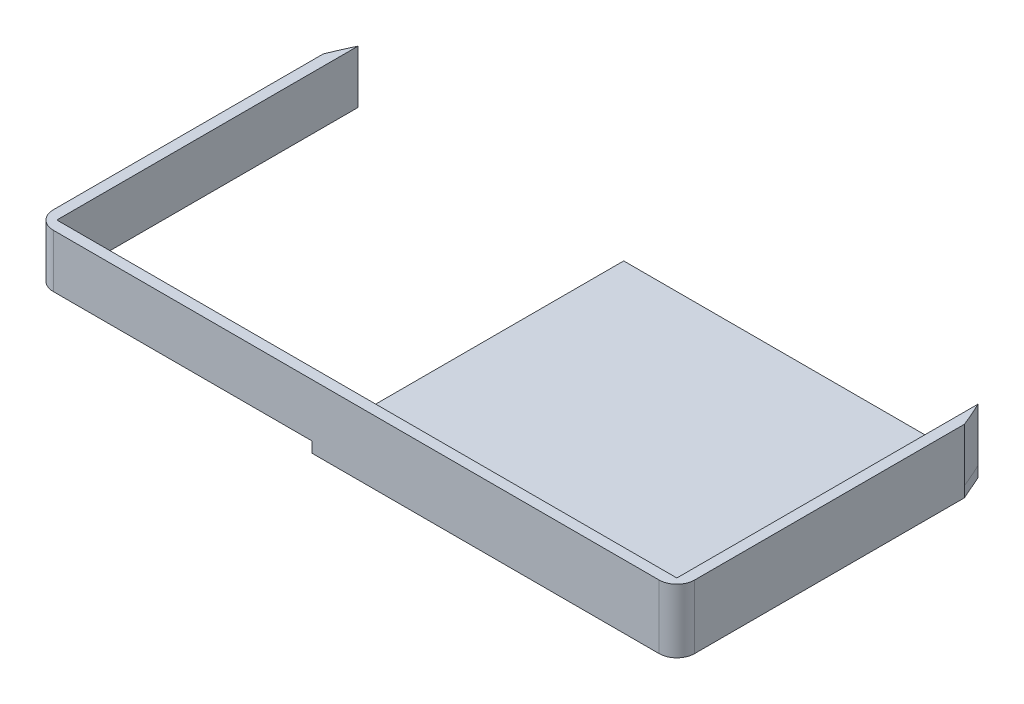
ISO-10303-21;
HEADER;
FILE_DESCRIPTION(('STEP AP214'),'2;1');
FILE_NAME('part.step','',(''),(''),'','','');
FILE_SCHEMA(('AUTOMOTIVE_DESIGN { 1 0 10303 214 1 1 1 1 }'));
ENDSEC;
DATA;
#1=APPLICATION_CONTEXT('core data for automotive mechanical design processes');
#2=APPLICATION_PROTOCOL_DEFINITION('international standard','automotive_design',2000,#1);
#3=PRODUCT_CONTEXT('',#1,'mechanical');
#4=PRODUCT('Part','Part','',(#3));
#5=PRODUCT_RELATED_PRODUCT_CATEGORY('part','',(#4));
#6=PRODUCT_DEFINITION_FORMATION('','',#4);
#7=PRODUCT_DEFINITION_CONTEXT('part definition',#1,'design');
#8=PRODUCT_DEFINITION('design','',#6,#7);
#9=PRODUCT_DEFINITION_SHAPE('','',#8);
#10=(LENGTH_UNIT() NAMED_UNIT(*) SI_UNIT(.MILLI.,.METRE.));
#11=(NAMED_UNIT(*) PLANE_ANGLE_UNIT() SI_UNIT($,.RADIAN.));
#12=(NAMED_UNIT(*) SI_UNIT($,.STERADIAN.) SOLID_ANGLE_UNIT());
#13=UNCERTAINTY_MEASURE_WITH_UNIT(LENGTH_MEASURE(1.E-05),#10,'distance_accuracy_value','');
#14=(GEOMETRIC_REPRESENTATION_CONTEXT(3) GLOBAL_UNCERTAINTY_ASSIGNED_CONTEXT((#13)) GLOBAL_UNIT_ASSIGNED_CONTEXT((#10,
#11,#12)) REPRESENTATION_CONTEXT('',''));
#15=CARTESIAN_POINT('',(0.,0.,0.));
#16=DIRECTION('',(0.,0.,1.));
#17=DIRECTION('',(1.,0.,0.));
#18=AXIS2_PLACEMENT_3D('',#15,#16,#17);
#19=CARTESIAN_POINT('',(0.,0.,0.));
#20=DIRECTION('',(0.,1.,0.));
#21=DIRECTION('',(0.,0.,1.));
#22=AXIS2_PLACEMENT_3D('',#19,#20,#21);
#23=PLANE('',#22);
#24=CARTESIAN_POINT('',(0.,0.,0.));
#25=DIRECTION('',(0.,1.,0.));
#26=DIRECTION('',(0.,0.,1.));
#27=AXIS2_PLACEMENT_3D('',#24,#25,#26);
#28=CIRCLE('',#27,97.2753822917186);
#29=CARTESIAN_POINT('',(87.5,0.,-42.5));
#30=VERTEX_POINT('',#29);
#31=CARTESIAN_POINT('',(90.5,0.,-35.6686136540236));
#32=VERTEX_POINT('',#31);
#33=EDGE_CURVE('E160',#30,#32,#28,.F.);
#34=ORIENTED_EDGE('',*,*,#33,.T.);
#35=DIRECTION('',(-0.402086111054041,0.,-0.915601856320441));
#36=VECTOR('',#35,1.);
#37=CARTESIAN_POINT('',(87.5,0.,-42.5));
#38=LINE('',#37,#36);
#39=EDGE_CURVE('E300',#32,#30,#38,.T.);
#40=ORIENTED_EDGE('',*,*,#39,.T.);
#41=EDGE_LOOP('',(#34,#40));
#42=FACE_BOUND('',#41,.T.);
#43=ADVANCED_FACE('F41',(#42),#23,.F.);
#44=CARTESIAN_POINT('',(-85.5,15.,40.5));
#45=DIRECTION('',(0.,-1.,0.));
#46=DIRECTION('',(0.,0.,-1.));
#47=AXIS2_PLACEMENT_3D('',#44,#45,#46);
#48=CYLINDRICAL_SURFACE('',#47,5.);
#49=CARTESIAN_POINT('',(-85.5,0.,40.5));
#50=DIRECTION('',(0.,1.,0.));
#51=DIRECTION('',(0.,0.,1.));
#52=AXIS2_PLACEMENT_3D('',#49,#50,#51);
#53=CIRCLE('',#52,5.);
#54=CARTESIAN_POINT('',(-85.5,0.,45.5));
#55=VERTEX_POINT('',#54);
#56=CARTESIAN_POINT('',(-90.5,0.,40.5));
#57=VERTEX_POINT('',#56);
#58=EDGE_CURVE('E152',#55,#57,#53,.F.);
#59=ORIENTED_EDGE('',*,*,#58,.F.);
#60=DIRECTION('',(0.,-1.,0.));
#61=VECTOR('',#60,1.);
#62=CARTESIAN_POINT('',(-85.5,15.,45.5));
#63=LINE('',#62,#61);
#64=CARTESIAN_POINT('',(-85.5,15.,45.5));
#65=VERTEX_POINT('',#64);
#66=EDGE_CURVE('E45',#65,#55,#63,.T.);
#67=ORIENTED_EDGE('',*,*,#66,.F.);
#68=CARTESIAN_POINT('',(-85.5,15.,40.5));
#69=DIRECTION('',(0.,1.,0.));
#70=DIRECTION('',(0.,0.,1.));
#71=AXIS2_PLACEMENT_3D('',#68,#69,#70);
#72=CIRCLE('',#71,5.);
#73=CARTESIAN_POINT('',(-90.5,15.,40.5));
#74=VERTEX_POINT('',#73);
#75=EDGE_CURVE('E182',#65,#74,#72,.F.);
#76=ORIENTED_EDGE('',*,*,#75,.T.);
#77=DIRECTION('',(0.,-1.,0.));
#78=VECTOR('',#77,1.);
#79=CARTESIAN_POINT('',(-90.5,15.,40.5));
#80=LINE('',#79,#78);
#81=EDGE_CURVE('E67',#74,#57,#80,.T.);
#82=ORIENTED_EDGE('',*,*,#81,.T.);
#83=EDGE_LOOP('',(#59,#67,#76,#82));
#84=FACE_BOUND('',#83,.T.);
#85=ADVANCED_FACE('F43',(#84),#48,.T.);
#86=CARTESIAN_POINT('',(0.,15.,45.5));
#87=DIRECTION('',(0.,0.,-1.));
#88=DIRECTION('',(-1.,0.,0.));
#89=AXIS2_PLACEMENT_3D('',#86,#87,#88);
#90=PLANE('',#89);
#91=DIRECTION('',(1.,0.,0.));
#92=VECTOR('',#91,1.);
#93=CARTESIAN_POINT('',(0.,0.,45.5));
#94=LINE('',#93,#92);
#95=CARTESIAN_POINT('',(-12.5,0.,45.5));
#96=VERTEX_POINT('',#95);
#97=EDGE_CURVE('E155',#55,#96,#94,.T.);
#98=ORIENTED_EDGE('',*,*,#97,.T.);
#99=DIRECTION('',(0.,1.,0.));
#100=VECTOR('',#99,1.);
#101=CARTESIAN_POINT('',(-12.5,-3.,45.5));
#102=LINE('',#101,#100);
#103=CARTESIAN_POINT('',(-12.5,-3.,45.5));
#104=VERTEX_POINT('',#103);
#105=EDGE_CURVE('E59',#104,#96,#102,.T.);
#106=ORIENTED_EDGE('',*,*,#105,.F.);
#107=DIRECTION('',(1.,0.,0.));
#108=VECTOR('',#107,1.);
#109=CARTESIAN_POINT('',(-12.5,-3.,45.5));
#110=LINE('',#109,#108);
#111=CARTESIAN_POINT('',(85.5,-3.,45.5));
#112=VERTEX_POINT('',#111);
#113=EDGE_CURVE('E296',#104,#112,#110,.T.);
#114=ORIENTED_EDGE('',*,*,#113,.T.);
#115=DIRECTION('',(0.,-1.,0.));
#116=VECTOR('',#115,1.);
#117=CARTESIAN_POINT('',(85.5,15.,45.5));
#118=LINE('',#117,#116);
#119=CARTESIAN_POINT('',(85.5,15.,45.5));
#120=VERTEX_POINT('',#119);
#121=EDGE_CURVE('E204',#120,#112,#118,.T.);
#122=ORIENTED_EDGE('',*,*,#121,.F.);
#123=DIRECTION('',(1.,0.,0.));
#124=VECTOR('',#123,1.);
#125=CARTESIAN_POINT('',(0.,15.,45.5));
#126=LINE('',#125,#124);
#127=EDGE_CURVE('E217',#65,#120,#126,.T.);
#128=ORIENTED_EDGE('',*,*,#127,.F.);
#129=ORIENTED_EDGE('',*,*,#66,.T.);
#130=EDGE_LOOP('',(#98,#106,#114,#122,#128,#129));
#131=FACE_BOUND('',#130,.T.);
#132=ADVANCED_FACE('F216',(#131),#90,.F.);
#133=CARTESIAN_POINT('',(85.5,15.,40.5));
#134=DIRECTION('',(0.,-1.,0.));
#135=DIRECTION('',(0.,0.,-1.));
#136=AXIS2_PLACEMENT_3D('',#133,#134,#135);
#137=CYLINDRICAL_SURFACE('',#136,5.);
#138=ORIENTED_EDGE('',*,*,#121,.T.);
#139=CARTESIAN_POINT('',(85.5,-3.,40.5));
#140=DIRECTION('',(0.,1.,0.));
#141=DIRECTION('',(0.,0.,1.));
#142=AXIS2_PLACEMENT_3D('',#139,#140,#141);
#143=CIRCLE('',#142,5.);
#144=CARTESIAN_POINT('',(90.5,-3.,40.5));
#145=VERTEX_POINT('',#144);
#146=EDGE_CURVE('E290',#112,#145,#143,.T.);
#147=ORIENTED_EDGE('',*,*,#146,.T.);
#148=DIRECTION('',(0.,-1.,0.));
#149=VECTOR('',#148,1.);
#150=CARTESIAN_POINT('',(90.5,15.,40.5));
#151=LINE('',#150,#149);
#152=CARTESIAN_POINT('',(90.5,15.,40.5));
#153=VERTEX_POINT('',#152);
#154=EDGE_CURVE('E201',#153,#145,#151,.T.);
#155=ORIENTED_EDGE('',*,*,#154,.F.);
#156=CARTESIAN_POINT('',(85.5,15.,40.5));
#157=DIRECTION('',(0.,1.,0.));
#158=DIRECTION('',(0.,0.,1.));
#159=AXIS2_PLACEMENT_3D('',#156,#157,#158);
#160=CIRCLE('',#159,5.);
#161=EDGE_CURVE('E321',#120,#153,#160,.T.);
#162=ORIENTED_EDGE('',*,*,#161,.F.);
#163=EDGE_LOOP('',(#138,#147,#155,#162));
#164=FACE_BOUND('',#163,.T.);
#165=ADVANCED_FACE('F225',(#164),#137,.T.);
#166=CARTESIAN_POINT('',(90.5,15.,0.));
#167=DIRECTION('',(-1.,0.,0.));
#168=DIRECTION('',(0.,0.,1.));
#169=AXIS2_PLACEMENT_3D('',#166,#167,#168);
#170=PLANE('',#169);
#171=ORIENTED_EDGE('',*,*,#154,.T.);
#172=DIRECTION('',(0.,0.,-1.));
#173=VECTOR('',#172,1.);
#174=CARTESIAN_POINT('',(90.5,-3.,40.5));
#175=LINE('',#174,#173);
#176=CARTESIAN_POINT('',(90.5,-3.,-35.6686136540236));
#177=VERTEX_POINT('',#176);
#178=EDGE_CURVE('E269',#145,#177,#175,.T.);
#179=ORIENTED_EDGE('',*,*,#178,.T.);
#180=DIRECTION('',(0.,1.,0.));
#181=VECTOR('',#180,1.);
#182=CARTESIAN_POINT('',(90.5,-3.,-35.6686136540236));
#183=LINE('',#182,#181);
#184=EDGE_CURVE('E156',#177,#32,#183,.T.);
#185=ORIENTED_EDGE('',*,*,#184,.T.);
#186=DIRECTION('',(0.,-1.,0.));
#187=VECTOR('',#186,1.);
#188=CARTESIAN_POINT('',(90.5,15.,-35.6686136540236));
#189=LINE('',#188,#187);
#190=CARTESIAN_POINT('',(90.5,15.,-35.6686136540236));
#191=VERTEX_POINT('',#190);
#192=EDGE_CURVE('E197',#191,#32,#189,.T.);
#193=ORIENTED_EDGE('',*,*,#192,.F.);
#194=DIRECTION('',(0.,0.,-1.));
#195=VECTOR('',#194,1.);
#196=CARTESIAN_POINT('',(90.5,15.,0.));
#197=LINE('',#196,#195);
#198=EDGE_CURVE('E324',#153,#191,#197,.T.);
#199=ORIENTED_EDGE('',*,*,#198,.F.);
#200=EDGE_LOOP('',(#171,#179,#185,#193,#199));
#201=FACE_BOUND('',#200,.T.);
#202=ADVANCED_FACE('F282',(#201),#170,.F.);
#203=CARTESIAN_POINT('',(0.,15.,0.));
#204=DIRECTION('',(0.,-1.,0.));
#205=DIRECTION('',(0.,0.,-1.));
#206=AXIS2_PLACEMENT_3D('',#203,#204,#205);
#207=CYLINDRICAL_SURFACE('',#206,97.2753822917186);
#208=ORIENTED_EDGE('',*,*,#33,.F.);
#209=DIRECTION('',(0.,-1.,0.));
#210=VECTOR('',#209,1.);
#211=CARTESIAN_POINT('',(87.5,15.,-42.5));
#212=LINE('',#211,#210);
#213=CARTESIAN_POINT('',(87.5,15.,-42.5));
#214=VERTEX_POINT('',#213);
#215=EDGE_CURVE('E193',#214,#30,#212,.T.);
#216=ORIENTED_EDGE('',*,*,#215,.F.);
#217=CARTESIAN_POINT('',(0.,15.,0.));
#218=DIRECTION('',(0.,1.,0.));
#219=DIRECTION('',(0.,0.,1.));
#220=AXIS2_PLACEMENT_3D('',#217,#218,#219);
#221=CIRCLE('',#220,97.2753822917186);
#222=EDGE_CURVE('E327',#214,#191,#221,.F.);
#223=ORIENTED_EDGE('',*,*,#222,.T.);
#224=ORIENTED_EDGE('',*,*,#192,.T.);
#225=EDGE_LOOP('',(#208,#216,#223,#224));
#226=FACE_BOUND('',#225,.T.);
#227=ADVANCED_FACE('F356',(#226),#207,.T.);
#228=CARTESIAN_POINT('',(87.5,15.,0.));
#229=DIRECTION('',(-1.,0.,0.));
#230=DIRECTION('',(0.,0.,1.));
#231=AXIS2_PLACEMENT_3D('',#228,#229,#230);
#232=PLANE('',#231);
#233=DIRECTION('',(0.,0.,-1.));
#234=VECTOR('',#233,1.);
#235=CARTESIAN_POINT('',(87.5,0.,0.));
#236=LINE('',#235,#234);
#237=CARTESIAN_POINT('',(87.5,0.,42.5));
#238=VERTEX_POINT('',#237);
#239=EDGE_CURVE('E164',#238,#30,#236,.T.);
#240=ORIENTED_EDGE('',*,*,#239,.F.);
#241=DIRECTION('',(0.,-1.,0.));
#242=VECTOR('',#241,1.);
#243=CARTESIAN_POINT('',(87.5,15.,42.5));
#244=LINE('',#243,#242);
#245=CARTESIAN_POINT('',(87.5,15.,42.5));
#246=VERTEX_POINT('',#245);
#247=EDGE_CURVE('E189',#246,#238,#244,.T.);
#248=ORIENTED_EDGE('',*,*,#247,.F.);
#249=DIRECTION('',(0.,0.,-1.));
#250=VECTOR('',#249,1.);
#251=CARTESIAN_POINT('',(87.5,15.,0.));
#252=LINE('',#251,#250);
#253=EDGE_CURVE('E331',#246,#214,#252,.T.);
#254=ORIENTED_EDGE('',*,*,#253,.T.);
#255=ORIENTED_EDGE('',*,*,#215,.T.);
#256=EDGE_LOOP('',(#240,#248,#254,#255));
#257=FACE_BOUND('',#256,.T.);
#258=ADVANCED_FACE('F345',(#257),#232,.T.);
#259=CARTESIAN_POINT('',(0.,15.,42.5));
#260=DIRECTION('',(0.,0.,-1.));
#261=DIRECTION('',(-1.,0.,0.));
#262=AXIS2_PLACEMENT_3D('',#259,#260,#261);
#263=PLANE('',#262);
#264=DIRECTION('',(1.,0.,0.));
#265=VECTOR('',#264,1.);
#266=CARTESIAN_POINT('',(0.,0.,42.5));
#267=LINE('',#266,#265);
#268=CARTESIAN_POINT('',(-87.5,0.,42.5));
#269=VERTEX_POINT('',#268);
#270=CARTESIAN_POINT('',(-12.5,0.,42.5));
#271=VERTEX_POINT('',#270);
#272=EDGE_CURVE('E169',#269,#271,#267,.T.);
#273=ORIENTED_EDGE('',*,*,#272,.F.);
#274=DIRECTION('',(0.,-1.,0.));
#275=VECTOR('',#274,1.);
#276=CARTESIAN_POINT('',(-87.5,15.,42.5));
#277=LINE('',#276,#275);
#278=CARTESIAN_POINT('',(-87.5,15.,42.5));
#279=VERTEX_POINT('',#278);
#280=EDGE_CURVE('E141',#279,#269,#277,.T.);
#281=ORIENTED_EDGE('',*,*,#280,.F.);
#282=DIRECTION('',(1.,0.,0.));
#283=VECTOR('',#282,1.);
#284=CARTESIAN_POINT('',(0.,15.,42.5));
#285=LINE('',#284,#283);
#286=EDGE_CURVE('E128',#279,#246,#285,.T.);
#287=ORIENTED_EDGE('',*,*,#286,.T.);
#288=ORIENTED_EDGE('',*,*,#247,.T.);
#289=EDGE_CURVE('E168',#271,#238,#267,.T.);
#290=ORIENTED_EDGE('',*,*,#289,.F.);
#291=EDGE_LOOP('',(#273,#281,#287,#288,#290));
#292=FACE_BOUND('',#291,.T.);
#293=ADVANCED_FACE('F337',(#292),#263,.T.);
#294=CARTESIAN_POINT('',(-87.5,15.,0.));
#295=DIRECTION('',(-1.,0.,0.));
#296=DIRECTION('',(0.,0.,1.));
#297=AXIS2_PLACEMENT_3D('',#294,#295,#296);
#298=PLANE('',#297);
#299=DIRECTION('',(0.,0.,-1.));
#300=VECTOR('',#299,1.);
#301=CARTESIAN_POINT('',(-87.5,0.,0.));
#302=LINE('',#301,#300);
#303=CARTESIAN_POINT('',(-87.5,0.,-42.5));
#304=VERTEX_POINT('',#303);
#305=EDGE_CURVE('E136',#269,#304,#302,.T.);
#306=ORIENTED_EDGE('',*,*,#305,.T.);
#307=DIRECTION('',(0.,-1.,0.));
#308=VECTOR('',#307,1.);
#309=CARTESIAN_POINT('',(-87.5,15.,-42.5));
#310=LINE('',#309,#308);
#311=CARTESIAN_POINT('',(-87.5,15.,-42.5));
#312=VERTEX_POINT('',#311);
#313=EDGE_CURVE('E133',#312,#304,#310,.T.);
#314=ORIENTED_EDGE('',*,*,#313,.F.);
#315=DIRECTION('',(0.,0.,-1.));
#316=VECTOR('',#315,1.);
#317=CARTESIAN_POINT('',(-87.5,15.,0.));
#318=LINE('',#317,#316);
#319=EDGE_CURVE('E118',#279,#312,#318,.T.);
#320=ORIENTED_EDGE('',*,*,#319,.F.);
#321=ORIENTED_EDGE('',*,*,#280,.T.);
#322=EDGE_LOOP('',(#306,#314,#320,#321));
#323=FACE_BOUND('',#322,.T.);
#324=ADVANCED_FACE('F134',(#323),#298,.F.);
#325=CARTESIAN_POINT('',(0.,15.,0.));
#326=DIRECTION('',(0.,-1.,0.));
#327=DIRECTION('',(0.,0.,-1.));
#328=AXIS2_PLACEMENT_3D('',#325,#326,#327);
#329=CYLINDRICAL_SURFACE('',#328,97.2753822917186);
#330=CARTESIAN_POINT('',(0.,0.,0.));
#331=DIRECTION('',(0.,1.,0.));
#332=DIRECTION('',(0.,0.,1.));
#333=AXIS2_PLACEMENT_3D('',#330,#331,#332);
#334=CIRCLE('',#333,97.2753822917186);
#335=CARTESIAN_POINT('',(-90.5,0.,-35.6686136540235));
#336=VERTEX_POINT('',#335);
#337=EDGE_CURVE('E175',#304,#336,#334,.T.);
#338=ORIENTED_EDGE('',*,*,#337,.T.);
#339=DIRECTION('',(0.,-1.,0.));
#340=VECTOR('',#339,1.);
#341=CARTESIAN_POINT('',(-90.5,15.,-35.6686136540235));
#342=LINE('',#341,#340);
#343=CARTESIAN_POINT('',(-90.5,15.,-35.6686136540235));
#344=VERTEX_POINT('',#343);
#345=EDGE_CURVE('E142',#344,#336,#342,.T.);
#346=ORIENTED_EDGE('',*,*,#345,.F.);
#347=CARTESIAN_POINT('',(0.,15.,0.));
#348=DIRECTION('',(0.,1.,0.));
#349=DIRECTION('',(0.,0.,1.));
#350=AXIS2_PLACEMENT_3D('',#347,#348,#349);
#351=CIRCLE('',#350,97.2753822917186);
#352=EDGE_CURVE('E124',#312,#344,#351,.T.);
#353=ORIENTED_EDGE('',*,*,#352,.F.);
#354=ORIENTED_EDGE('',*,*,#313,.T.);
#355=EDGE_LOOP('',(#338,#346,#353,#354));
#356=FACE_BOUND('',#355,.T.);
#357=ADVANCED_FACE('F144',(#356),#329,.T.);
#358=CARTESIAN_POINT('',(-90.5,15.,0.));
#359=DIRECTION('',(-1.,0.,0.));
#360=DIRECTION('',(0.,0.,1.));
#361=AXIS2_PLACEMENT_3D('',#358,#359,#360);
#362=PLANE('',#361);
#363=DIRECTION('',(0.,0.,-1.));
#364=VECTOR('',#363,1.);
#365=CARTESIAN_POINT('',(-90.5,0.,0.));
#366=LINE('',#365,#364);
#367=EDGE_CURVE('E178',#57,#336,#366,.T.);
#368=ORIENTED_EDGE('',*,*,#367,.F.);
#369=ORIENTED_EDGE('',*,*,#81,.F.);
#370=DIRECTION('',(0.,0.,-1.));
#371=VECTOR('',#370,1.);
#372=CARTESIAN_POINT('',(-90.5,15.,0.));
#373=LINE('',#372,#371);
#374=EDGE_CURVE('E146',#74,#344,#373,.T.);
#375=ORIENTED_EDGE('',*,*,#374,.T.);
#376=ORIENTED_EDGE('',*,*,#345,.T.);
#377=EDGE_LOOP('',(#368,#369,#375,#376));
#378=FACE_BOUND('',#377,.T.);
#379=ADVANCED_FACE('F241',(#378),#362,.T.);
#380=CARTESIAN_POINT('',(0.,15.,0.));
#381=DIRECTION('',(0.,1.,0.));
#382=DIRECTION('',(0.,0.,1.));
#383=AXIS2_PLACEMENT_3D('',#380,#381,#382);
#384=PLANE('',#383);
#385=ORIENTED_EDGE('',*,*,#75,.F.);
#386=ORIENTED_EDGE('',*,*,#127,.T.);
#387=ORIENTED_EDGE('',*,*,#161,.T.);
#388=ORIENTED_EDGE('',*,*,#198,.T.);
#389=ORIENTED_EDGE('',*,*,#222,.F.);
#390=ORIENTED_EDGE('',*,*,#253,.F.);
#391=ORIENTED_EDGE('',*,*,#286,.F.);
#392=ORIENTED_EDGE('',*,*,#319,.T.);
#393=ORIENTED_EDGE('',*,*,#352,.T.);
#394=ORIENTED_EDGE('',*,*,#374,.F.);
#395=EDGE_LOOP('',(#385,#386,#387,#388,#389,#390,#391,#392,#393,#394));
#396=FACE_BOUND('',#395,.T.);
#397=ADVANCED_FACE('F121',(#396),#384,.T.);
#398=ORIENTED_EDGE('',*,*,#272,.T.);
#399=DIRECTION('',(0.,0.,1.));
#400=VECTOR('',#399,1.);
#401=CARTESIAN_POINT('',(-12.5,0.,-42.5));
#402=LINE('',#401,#400);
#403=EDGE_CURVE('E11',#271,#96,#402,.T.);
#404=ORIENTED_EDGE('',*,*,#403,.T.);
#405=ORIENTED_EDGE('',*,*,#97,.F.);
#406=ORIENTED_EDGE('',*,*,#58,.T.);
#407=ORIENTED_EDGE('',*,*,#367,.T.);
#408=ORIENTED_EDGE('',*,*,#337,.F.);
#409=ORIENTED_EDGE('',*,*,#305,.F.);
#410=EDGE_LOOP('',(#398,#404,#405,#406,#407,#408,#409));
#411=FACE_BOUND('',#410,.T.);
#412=ADVANCED_FACE('F219',(#411),#23,.F.);
#413=CARTESIAN_POINT('',(87.5,-3.,-42.5));
#414=DIRECTION('',(0.915601856320441,0.,-0.402086111054041));
#415=DIRECTION('',(-0.402086111054041,0.,-0.915601856320441));
#416=AXIS2_PLACEMENT_3D('',#413,#414,#415);
#417=PLANE('',#416);
#418=ORIENTED_EDGE('',*,*,#39,.F.);
#419=ORIENTED_EDGE('',*,*,#184,.F.);
#420=DIRECTION('',(-0.402086111054041,0.,-0.915601856320441));
#421=VECTOR('',#420,1.);
#422=CARTESIAN_POINT('',(87.5,-3.,-42.5));
#423=LINE('',#422,#421);
#424=CARTESIAN_POINT('',(87.5,-3.,-42.5));
#425=VERTEX_POINT('',#424);
#426=EDGE_CURVE('E266',#177,#425,#423,.T.);
#427=ORIENTED_EDGE('',*,*,#426,.T.);
#428=DIRECTION('',(0.,1.,0.));
#429=VECTOR('',#428,1.);
#430=CARTESIAN_POINT('',(87.5,-3.,-42.5));
#431=LINE('',#430,#429);
#432=EDGE_CURVE('E289',#425,#30,#431,.T.);
#433=ORIENTED_EDGE('',*,*,#432,.T.);
#434=EDGE_LOOP('',(#418,#419,#427,#433));
#435=FACE_BOUND('',#434,.T.);
#436=ADVANCED_FACE('F233',(#435),#417,.T.);
#437=CARTESIAN_POINT('',(-12.5,-3.,-42.5));
#438=DIRECTION('',(-1.,0.,0.));
#439=DIRECTION('',(0.,0.,1.));
#440=AXIS2_PLACEMENT_3D('',#437,#438,#439);
#441=PLANE('',#440);
#442=CARTESIAN_POINT('',(-12.5,0.,-42.5));
#443=VERTEX_POINT('',#442);
#444=EDGE_CURVE('E52',#443,#271,#402,.T.);
#445=ORIENTED_EDGE('',*,*,#444,.F.);
#446=DIRECTION('',(0.,1.,0.));
#447=VECTOR('',#446,1.);
#448=CARTESIAN_POINT('',(-12.5,-3.,-42.5));
#449=LINE('',#448,#447);
#450=CARTESIAN_POINT('',(-12.5,-3.,-42.5));
#451=VERTEX_POINT('',#450);
#452=EDGE_CURVE('E294',#451,#443,#449,.T.);
#453=ORIENTED_EDGE('',*,*,#452,.F.);
#454=DIRECTION('',(0.,0.,1.));
#455=VECTOR('',#454,1.);
#456=CARTESIAN_POINT('',(-12.5,-3.,-42.5));
#457=LINE('',#456,#455);
#458=EDGE_CURVE('E483',#451,#104,#457,.T.);
#459=ORIENTED_EDGE('',*,*,#458,.T.);
#460=ORIENTED_EDGE('',*,*,#105,.T.);
#461=ORIENTED_EDGE('',*,*,#403,.F.);
#462=EDGE_LOOP('',(#445,#453,#459,#460,#461));
#463=FACE_BOUND('',#462,.T.);
#464=ADVANCED_FACE('F238',(#463),#441,.T.);
#465=CARTESIAN_POINT('',(87.5,-3.,-42.5));
#466=DIRECTION('',(0.,0.,-1.));
#467=DIRECTION('',(-1.,0.,0.));
#468=AXIS2_PLACEMENT_3D('',#465,#466,#467);
#469=PLANE('',#468);
#470=DIRECTION('',(-1.,0.,0.));
#471=VECTOR('',#470,1.);
#472=CARTESIAN_POINT('',(87.5,0.,-42.5));
#473=LINE('',#472,#471);
#474=EDGE_CURVE('E304',#30,#443,#473,.T.);
#475=ORIENTED_EDGE('',*,*,#474,.F.);
#476=ORIENTED_EDGE('',*,*,#432,.F.);
#477=DIRECTION('',(-1.,0.,0.));
#478=VECTOR('',#477,1.);
#479=CARTESIAN_POINT('',(87.5,-3.,-42.5));
#480=LINE('',#479,#478);
#481=EDGE_CURVE('E273',#425,#451,#480,.T.);
#482=ORIENTED_EDGE('',*,*,#481,.T.);
#483=ORIENTED_EDGE('',*,*,#452,.T.);
#484=EDGE_LOOP('',(#475,#476,#482,#483));
#485=FACE_BOUND('',#484,.T.);
#486=ADVANCED_FACE('F246',(#485),#469,.T.);
#487=CARTESIAN_POINT('',(85.5,-3.,40.5));
#488=DIRECTION('',(0.,1.,0.));
#489=DIRECTION('',(0.,0.,1.));
#490=AXIS2_PLACEMENT_3D('',#487,#488,#489);
#491=PLANE('',#490);
#492=ORIENTED_EDGE('',*,*,#426,.F.);
#493=ORIENTED_EDGE('',*,*,#178,.F.);
#494=ORIENTED_EDGE('',*,*,#146,.F.);
#495=ORIENTED_EDGE('',*,*,#113,.F.);
#496=ORIENTED_EDGE('',*,*,#458,.F.);
#497=ORIENTED_EDGE('',*,*,#481,.F.);
#498=EDGE_LOOP('',(#492,#493,#494,#495,#496,#497));
#499=FACE_BOUND('',#498,.T.);
#500=ADVANCED_FACE('F249',(#499),#491,.F.);
#501=CARTESIAN_POINT('',(85.5,0.,40.5));
#502=DIRECTION('',(0.,1.,0.));
#503=DIRECTION('',(0.,0.,1.));
#504=AXIS2_PLACEMENT_3D('',#501,#502,#503);
#505=PLANE('',#504);
#506=ORIENTED_EDGE('',*,*,#444,.T.);
#507=ORIENTED_EDGE('',*,*,#289,.T.);
#508=ORIENTED_EDGE('',*,*,#239,.T.);
#509=ORIENTED_EDGE('',*,*,#474,.T.);
#510=EDGE_LOOP('',(#506,#507,#508,#509));
#511=FACE_BOUND('',#510,.T.);
#512=ADVANCED_FACE('F253',(#511),#505,.T.);
#513=CLOSED_SHELL('',(#43,#85,#132,#165,#202,#227,#258,#293,#324,#357,#379,#397,#412,#436,#464,
#486,#500,#512));
#514=MANIFOLD_SOLID_BREP('B2',#513);
#515=ADVANCED_BREP_SHAPE_REPRESENTATION('',(#18,#514),#14);
#516=SHAPE_DEFINITION_REPRESENTATION(#9,#515);
ENDSEC;
END-ISO-10303-21;
